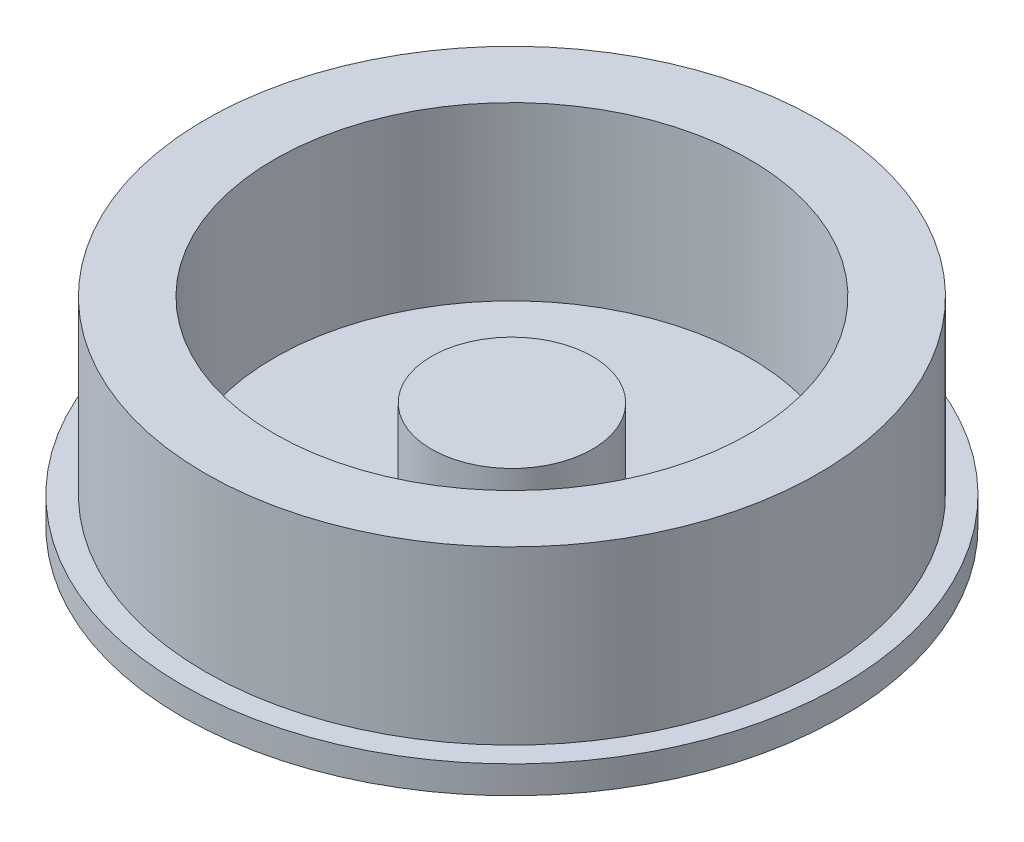
ISO-10303-21;
HEADER;
FILE_DESCRIPTION(('STEP AP214'),'2;1');
FILE_NAME('part.step','',(''),(''),'','','');
FILE_SCHEMA(('AUTOMOTIVE_DESIGN { 1 0 10303 214 1 1 1 1 }'));
ENDSEC;
DATA;
#1=APPLICATION_CONTEXT('core data for automotive mechanical design processes');
#2=APPLICATION_PROTOCOL_DEFINITION('international standard','automotive_design',2000,#1);
#3=PRODUCT_CONTEXT('',#1,'mechanical');
#4=PRODUCT('Part','Part','',(#3));
#5=PRODUCT_RELATED_PRODUCT_CATEGORY('part','',(#4));
#6=PRODUCT_DEFINITION_FORMATION('','',#4);
#7=PRODUCT_DEFINITION_CONTEXT('part definition',#1,'design');
#8=PRODUCT_DEFINITION('design','',#6,#7);
#9=PRODUCT_DEFINITION_SHAPE('','',#8);
#10=(LENGTH_UNIT() NAMED_UNIT(*) SI_UNIT(.MILLI.,.METRE.));
#11=(NAMED_UNIT(*) PLANE_ANGLE_UNIT() SI_UNIT($,.RADIAN.));
#12=(NAMED_UNIT(*) SI_UNIT($,.STERADIAN.) SOLID_ANGLE_UNIT());
#13=UNCERTAINTY_MEASURE_WITH_UNIT(LENGTH_MEASURE(1.E-05),#10,'distance_accuracy_value','');
#14=(GEOMETRIC_REPRESENTATION_CONTEXT(3) GLOBAL_UNCERTAINTY_ASSIGNED_CONTEXT((#13)) GLOBAL_UNIT_ASSIGNED_CONTEXT((#10,
#11,#12)) REPRESENTATION_CONTEXT('',''));
#15=CARTESIAN_POINT('',(0.,0.,0.));
#16=DIRECTION('',(0.,0.,1.));
#17=DIRECTION('',(1.,0.,0.));
#18=AXIS2_PLACEMENT_3D('',#15,#16,#17);
#19=CARTESIAN_POINT('',(0.,18.,0.));
#20=DIRECTION('',(0.,1.,0.));
#21=DIRECTION('',(0.,0.,1.));
#22=AXIS2_PLACEMENT_3D('',#19,#20,#21);
#23=PLANE('',#22);
#24=CARTESIAN_POINT('',(0.,18.,0.));
#25=DIRECTION('',(0.,1.,0.));
#26=DIRECTION('',(0.,0.,1.));
#27=AXIS2_PLACEMENT_3D('',#24,#25,#26);
#28=CIRCLE('',#27,200.);
#29=CARTESIAN_POINT('',(0.,18.,200.));
#30=VERTEX_POINT('',#29);
#31=EDGE_CURVE('E56',#30,#30,#28,.F.);
#32=ORIENTED_EDGE('',*,*,#31,.T.);
#33=EDGE_LOOP('',(#32));
#34=FACE_BOUND('',#33,.T.);
#35=CARTESIAN_POINT('',(0.,18.,0.));
#36=DIRECTION('',(0.,1.,0.));
#37=DIRECTION('',(0.,0.,1.));
#38=AXIS2_PLACEMENT_3D('',#35,#36,#37);
#39=CIRCLE('',#38,215.);
#40=CARTESIAN_POINT('',(0.,18.,215.));
#41=VERTEX_POINT('',#40);
#42=EDGE_CURVE('E45',#41,#41,#39,.T.);
#43=ORIENTED_EDGE('',*,*,#42,.T.);
#44=EDGE_LOOP('',(#43));
#45=FACE_BOUND('',#44,.T.);
#46=ADVANCED_FACE('F37',(#34,#45),#23,.T.);
#47=CARTESIAN_POINT('',(0.,0.,0.));
#48=DIRECTION('',(0.,1.,0.));
#49=DIRECTION('',(0.,0.,1.));
#50=AXIS2_PLACEMENT_3D('',#47,#48,#49);
#51=PLANE('',#50);
#52=CARTESIAN_POINT('',(0.,0.,0.));
#53=DIRECTION('',(0.,1.,0.));
#54=DIRECTION('',(0.,0.,1.));
#55=AXIS2_PLACEMENT_3D('',#52,#53,#54);
#56=CIRCLE('',#55,215.);
#57=CARTESIAN_POINT('',(0.,0.,215.));
#58=VERTEX_POINT('',#57);
#59=EDGE_CURVE('E50',#58,#58,#56,.T.);
#60=ORIENTED_EDGE('',*,*,#59,.F.);
#61=EDGE_LOOP('',(#60));
#62=FACE_BOUND('',#61,.T.);
#63=ADVANCED_FACE('F62',(#62),#51,.F.);
#64=CARTESIAN_POINT('',(0.,18.,0.));
#65=DIRECTION('',(0.,-1.,0.));
#66=DIRECTION('',(0.,0.,-1.));
#67=AXIS2_PLACEMENT_3D('',#64,#65,#66);
#68=CYLINDRICAL_SURFACE('',#67,215.);
#69=ORIENTED_EDGE('',*,*,#42,.F.);
#70=EDGE_LOOP('',(#69));
#71=FACE_BOUND('',#70,.T.);
#72=ORIENTED_EDGE('',*,*,#59,.T.);
#73=EDGE_LOOP('',(#72));
#74=FACE_BOUND('',#73,.T.);
#75=ADVANCED_FACE('F39',(#71,#74),#68,.T.);
#76=CARTESIAN_POINT('',(0.,130.,0.));
#77=DIRECTION('',(0.,1.,0.));
#78=DIRECTION('',(0.,0.,1.));
#79=AXIS2_PLACEMENT_3D('',#76,#77,#78);
#80=PLANE('',#79);
#81=CARTESIAN_POINT('',(0.,130.,0.));
#82=DIRECTION('',(0.,1.,0.));
#83=DIRECTION('',(0.,0.,1.));
#84=AXIS2_PLACEMENT_3D('',#81,#82,#83);
#85=CIRCLE('',#84,200.);
#86=CARTESIAN_POINT('',(0.,130.,200.));
#87=VERTEX_POINT('',#86);
#88=EDGE_CURVE('E54',#87,#87,#85,.T.);
#89=ORIENTED_EDGE('',*,*,#88,.T.);
#90=EDGE_LOOP('',(#89));
#91=FACE_BOUND('',#90,.T.);
#92=CARTESIAN_POINT('',(0.,130.,0.));
#93=DIRECTION('',(0.,1.,0.));
#94=DIRECTION('',(0.,0.,1.));
#95=AXIS2_PLACEMENT_3D('',#92,#93,#94);
#96=CIRCLE('',#95,155.);
#97=CARTESIAN_POINT('',(0.,130.,155.));
#98=VERTEX_POINT('',#97);
#99=EDGE_CURVE('E99',#98,#98,#96,.T.);
#100=ORIENTED_EDGE('',*,*,#99,.F.);
#101=EDGE_LOOP('',(#100));
#102=FACE_BOUND('',#101,.T.);
#103=ADVANCED_FACE('F68',(#91,#102),#80,.T.);
#104=CARTESIAN_POINT('',(0.,130.,0.));
#105=DIRECTION('',(0.,-1.,0.));
#106=DIRECTION('',(0.,0.,-1.));
#107=AXIS2_PLACEMENT_3D('',#104,#105,#106);
#108=CYLINDRICAL_SURFACE('',#107,200.);
#109=ORIENTED_EDGE('',*,*,#31,.F.);
#110=EDGE_LOOP('',(#109));
#111=FACE_BOUND('',#110,.T.);
#112=ORIENTED_EDGE('',*,*,#88,.F.);
#113=EDGE_LOOP('',(#112));
#114=FACE_BOUND('',#113,.T.);
#115=ADVANCED_FACE('F74',(#111,#114),#108,.T.);
#116=CARTESIAN_POINT('',(0.,130.,0.));
#117=DIRECTION('',(0.,-1.,0.));
#118=DIRECTION('',(0.,0.,-1.));
#119=AXIS2_PLACEMENT_3D('',#116,#117,#118);
#120=CYLINDRICAL_SURFACE('',#119,155.);
#121=CARTESIAN_POINT('',(0.,18.,0.));
#122=DIRECTION('',(0.,1.,0.));
#123=DIRECTION('',(0.,0.,1.));
#124=AXIS2_PLACEMENT_3D('',#121,#122,#123);
#125=CIRCLE('',#124,155.);
#126=CARTESIAN_POINT('',(0.,18.,155.));
#127=VERTEX_POINT('',#126);
#128=EDGE_CURVE('E10',#127,#127,#125,.F.);
#129=ORIENTED_EDGE('',*,*,#128,.T.);
#130=EDGE_LOOP('',(#129));
#131=FACE_BOUND('',#130,.T.);
#132=ORIENTED_EDGE('',*,*,#99,.T.);
#133=EDGE_LOOP('',(#132));
#134=FACE_BOUND('',#133,.T.);
#135=ADVANCED_FACE('F77',(#131,#134),#120,.F.);
#136=CARTESIAN_POINT('',(0.,18.,0.));
#137=DIRECTION('',(0.,1.,0.));
#138=DIRECTION('',(0.,0.,1.));
#139=AXIS2_PLACEMENT_3D('',#136,#137,#138);
#140=CIRCLE('',#139,52.5);
#141=CARTESIAN_POINT('',(0.,18.,52.5));
#142=VERTEX_POINT('',#141);
#143=EDGE_CURVE('E41',#142,#142,#140,.F.);
#144=ORIENTED_EDGE('',*,*,#143,.T.);
#145=EDGE_LOOP('',(#144));
#146=FACE_BOUND('',#145,.T.);
#147=ORIENTED_EDGE('',*,*,#128,.F.);
#148=EDGE_LOOP('',(#147));
#149=FACE_BOUND('',#148,.T.);
#150=ADVANCED_FACE('F72',(#146,#149),#23,.T.);
#151=CARTESIAN_POINT('',(0.,70.,0.));
#152=DIRECTION('',(0.,-1.,0.));
#153=DIRECTION('',(0.,0.,-1.));
#154=AXIS2_PLACEMENT_3D('',#151,#152,#153);
#155=CYLINDRICAL_SURFACE('',#154,52.5);
#156=ORIENTED_EDGE('',*,*,#143,.F.);
#157=EDGE_LOOP('',(#156));
#158=FACE_BOUND('',#157,.T.);
#159=CARTESIAN_POINT('',(0.,70.,0.));
#160=DIRECTION('',(0.,1.,0.));
#161=DIRECTION('',(0.,0.,1.));
#162=AXIS2_PLACEMENT_3D('',#159,#160,#161);
#163=CIRCLE('',#162,52.5);
#164=CARTESIAN_POINT('',(0.,70.,52.5));
#165=VERTEX_POINT('',#164);
#166=EDGE_CURVE('E95',#165,#165,#163,.T.);
#167=ORIENTED_EDGE('',*,*,#166,.F.);
#168=EDGE_LOOP('',(#167));
#169=FACE_BOUND('',#168,.T.);
#170=ADVANCED_FACE('F84',(#158,#169),#155,.T.);
#171=CARTESIAN_POINT('',(0.,70.,0.));
#172=DIRECTION('',(0.,1.,0.));
#173=DIRECTION('',(0.,0.,1.));
#174=AXIS2_PLACEMENT_3D('',#171,#172,#173);
#175=PLANE('',#174);
#176=ORIENTED_EDGE('',*,*,#166,.T.);
#177=EDGE_LOOP('',(#176));
#178=FACE_BOUND('',#177,.T.);
#179=ADVANCED_FACE('F87',(#178),#175,.T.);
#180=CLOSED_SHELL('',(#46,#63,#75,#103,#115,#135,#150,#170,#179));
#181=MANIFOLD_SOLID_BREP('B2',#180);
#182=ADVANCED_BREP_SHAPE_REPRESENTATION('',(#18,#181),#14);
#183=SHAPE_DEFINITION_REPRESENTATION(#9,#182);
ENDSEC;
END-ISO-10303-21;
